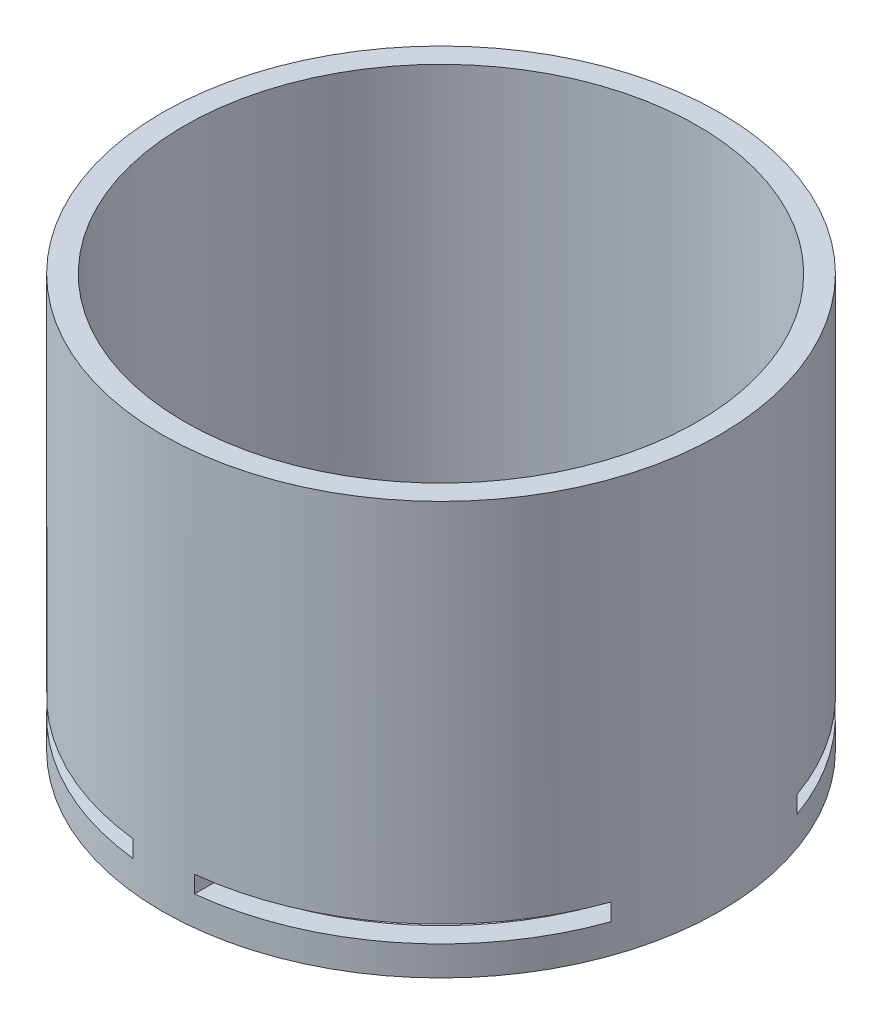
ISO-10303-21;
HEADER;
FILE_DESCRIPTION(('STEP AP214'),'2;1');
FILE_NAME('part.step','',(''),(''),'','','');
FILE_SCHEMA(('AUTOMOTIVE_DESIGN { 1 0 10303 214 1 1 1 1 }'));
ENDSEC;
DATA;
#1=APPLICATION_CONTEXT('core data for automotive mechanical design processes');
#2=APPLICATION_PROTOCOL_DEFINITION('international standard','automotive_design',2000,#1);
#3=PRODUCT_CONTEXT('',#1,'mechanical');
#4=PRODUCT('Part','Part','',(#3));
#5=PRODUCT_RELATED_PRODUCT_CATEGORY('part','',(#4));
#6=PRODUCT_DEFINITION_FORMATION('','',#4);
#7=PRODUCT_DEFINITION_CONTEXT('part definition',#1,'design');
#8=PRODUCT_DEFINITION('design','',#6,#7);
#9=PRODUCT_DEFINITION_SHAPE('','',#8);
#10=(LENGTH_UNIT() NAMED_UNIT(*) SI_UNIT(.MILLI.,.METRE.));
#11=(NAMED_UNIT(*) PLANE_ANGLE_UNIT() SI_UNIT($,.RADIAN.));
#12=(NAMED_UNIT(*) SI_UNIT($,.STERADIAN.) SOLID_ANGLE_UNIT());
#13=UNCERTAINTY_MEASURE_WITH_UNIT(LENGTH_MEASURE(1.E-05),#10,'distance_accuracy_value','');
#14=(GEOMETRIC_REPRESENTATION_CONTEXT(3) GLOBAL_UNCERTAINTY_ASSIGNED_CONTEXT((#13)) GLOBAL_UNIT_ASSIGNED_CONTEXT((#10,
#11,#12)) REPRESENTATION_CONTEXT('',''));
#15=CARTESIAN_POINT('',(0.,0.,0.));
#16=DIRECTION('',(0.,0.,1.));
#17=DIRECTION('',(1.,0.,0.));
#18=AXIS2_PLACEMENT_3D('',#15,#16,#17);
#19=CARTESIAN_POINT('',(0.,88.9,0.));
#20=DIRECTION('',(0.,-1.,0.));
#21=DIRECTION('',(0.,0.,-1.));
#22=AXIS2_PLACEMENT_3D('',#19,#20,#21);
#23=CYLINDRICAL_SURFACE('',#22,60.071);
#24=CARTESIAN_POINT('',(0.,6.34999999999999,0.));
#25=DIRECTION('',(0.,-1.,0.));
#26=DIRECTION('',(0.,0.,-1.));
#27=AXIS2_PLACEMENT_3D('',#24,#25,#26);
#28=CIRCLE('',#27,60.071);
#29=CARTESIAN_POINT('',(-6.604,6.34999999999999,59.7068859094159));
#30=VERTEX_POINT('',#29);
#31=CARTESIAN_POINT('',(-56.642,6.34999999999999,20.0052212434654));
#32=VERTEX_POINT('',#31);
#33=EDGE_CURVE('E229',#30,#32,#28,.T.);
#34=ORIENTED_EDGE('',*,*,#33,.T.);
#35=DIRECTION('',(0.,-1.,0.));
#36=VECTOR('',#35,1.);
#37=CARTESIAN_POINT('',(-56.642,88.9,20.0052212434654));
#38=LINE('',#37,#36);
#39=CARTESIAN_POINT('',(-56.642,10.033,20.0052212434654));
#40=VERTEX_POINT('',#39);
#41=EDGE_CURVE('E11',#32,#40,#38,.F.);
#42=ORIENTED_EDGE('',*,*,#41,.T.);
#43=CARTESIAN_POINT('',(0.,10.033,0.));
#44=DIRECTION('',(0.,1.,0.));
#45=DIRECTION('',(0.,0.,1.));
#46=AXIS2_PLACEMENT_3D('',#43,#44,#45);
#47=CIRCLE('',#46,60.071);
#48=CARTESIAN_POINT('',(-6.604,10.033,59.7068859094158));
#49=VERTEX_POINT('',#48);
#50=EDGE_CURVE('E199',#40,#49,#47,.T.);
#51=ORIENTED_EDGE('',*,*,#50,.T.);
#52=DIRECTION('',(0.,-1.,0.));
#53=VECTOR('',#52,1.);
#54=CARTESIAN_POINT('',(-6.604,88.9,59.7068859094159));
#55=LINE('',#54,#53);
#56=EDGE_CURVE('E232',#49,#30,#55,.T.);
#57=ORIENTED_EDGE('',*,*,#56,.T.);
#58=EDGE_LOOP('',(#34,#42,#51,#57));
#59=FACE_BOUND('',#58,.T.);
#60=CARTESIAN_POINT('',(-6.604,10.033,-59.7068859094159));
#61=VERTEX_POINT('',#60);
#62=CARTESIAN_POINT('',(-56.642,10.033,-20.0052212434654));
#63=VERTEX_POINT('',#62);
#64=EDGE_CURVE('E187',#61,#63,#47,.T.);
#65=ORIENTED_EDGE('',*,*,#64,.T.);
#66=DIRECTION('',(0.,-1.,0.));
#67=VECTOR('',#66,1.);
#68=CARTESIAN_POINT('',(-56.642,88.9,-20.0052212434654));
#69=LINE('',#68,#67);
#70=CARTESIAN_POINT('',(-56.642,6.34999999999999,-20.0052212434654));
#71=VERTEX_POINT('',#70);
#72=EDGE_CURVE('E49',#63,#71,#69,.T.);
#73=ORIENTED_EDGE('',*,*,#72,.T.);
#74=CARTESIAN_POINT('',(-6.604,6.34999999999999,-59.7068859094159));
#75=VERTEX_POINT('',#74);
#76=EDGE_CURVE('E186',#71,#75,#28,.T.);
#77=ORIENTED_EDGE('',*,*,#76,.T.);
#78=DIRECTION('',(0.,-1.,0.));
#79=VECTOR('',#78,1.);
#80=CARTESIAN_POINT('',(-6.604,88.9,-59.7068859094159));
#81=LINE('',#80,#79);
#82=EDGE_CURVE('E230',#75,#61,#81,.F.);
#83=ORIENTED_EDGE('',*,*,#82,.T.);
#84=EDGE_LOOP('',(#65,#73,#77,#83));
#85=FACE_BOUND('',#84,.T.);
#86=DIRECTION('',(0.,-1.,0.));
#87=VECTOR('',#86,1.);
#88=CARTESIAN_POINT('',(56.642,88.9,-20.0052212434654));
#89=LINE('',#88,#87);
#90=CARTESIAN_POINT('',(56.642,6.34999999999999,-20.0052212434654));
#91=VERTEX_POINT('',#90);
#92=CARTESIAN_POINT('',(56.642,10.033,-20.0052212434654));
#93=VERTEX_POINT('',#92);
#94=EDGE_CURVE('E178',#91,#93,#89,.F.);
#95=ORIENTED_EDGE('',*,*,#94,.T.);
#96=CARTESIAN_POINT('',(0.,10.033,0.));
#97=DIRECTION('',(0.,1.,0.));
#98=DIRECTION('',(0.,0.,1.));
#99=AXIS2_PLACEMENT_3D('',#96,#97,#98);
#100=CIRCLE('',#99,60.071);
#101=CARTESIAN_POINT('',(6.604,10.033,-59.7068859094159));
#102=VERTEX_POINT('',#101);
#103=EDGE_CURVE('E224',#93,#102,#100,.T.);
#104=ORIENTED_EDGE('',*,*,#103,.T.);
#105=DIRECTION('',(0.,-1.,0.));
#106=VECTOR('',#105,1.);
#107=CARTESIAN_POINT('',(6.604,88.9,-59.7068859094159));
#108=LINE('',#107,#106);
#109=CARTESIAN_POINT('',(6.604,6.35000000000001,-59.7068859094159));
#110=VERTEX_POINT('',#109);
#111=EDGE_CURVE('E204',#102,#110,#108,.T.);
#112=ORIENTED_EDGE('',*,*,#111,.T.);
#113=CARTESIAN_POINT('',(0.,6.34999999999999,0.));
#114=DIRECTION('',(0.,-1.,0.));
#115=DIRECTION('',(0.,0.,-1.));
#116=AXIS2_PLACEMENT_3D('',#113,#114,#115);
#117=CIRCLE('',#116,60.071);
#118=EDGE_CURVE('E148',#110,#91,#117,.T.);
#119=ORIENTED_EDGE('',*,*,#118,.T.);
#120=EDGE_LOOP('',(#95,#104,#112,#119));
#121=FACE_BOUND('',#120,.T.);
#122=DIRECTION('',(0.,-1.,0.));
#123=VECTOR('',#122,1.);
#124=CARTESIAN_POINT('',(6.604,88.9,59.7068859094159));
#125=LINE('',#124,#123);
#126=CARTESIAN_POINT('',(6.604,6.35,59.7068859094158));
#127=VERTEX_POINT('',#126);
#128=CARTESIAN_POINT('',(6.604,10.033,59.7068859094159));
#129=VERTEX_POINT('',#128);
#130=EDGE_CURVE('E200',#127,#129,#125,.F.);
#131=ORIENTED_EDGE('',*,*,#130,.T.);
#132=CARTESIAN_POINT('',(56.642,10.033,20.0052212434654));
#133=VERTEX_POINT('',#132);
#134=EDGE_CURVE('E227',#129,#133,#100,.T.);
#135=ORIENTED_EDGE('',*,*,#134,.T.);
#136=DIRECTION('',(0.,-1.,0.));
#137=VECTOR('',#136,1.);
#138=CARTESIAN_POINT('',(56.642,88.9,20.0052212434654));
#139=LINE('',#138,#137);
#140=CARTESIAN_POINT('',(56.642,6.34999999999999,20.0052212434654));
#141=VERTEX_POINT('',#140);
#142=EDGE_CURVE('E175',#133,#141,#139,.T.);
#143=ORIENTED_EDGE('',*,*,#142,.T.);
#144=EDGE_CURVE('E221',#141,#127,#117,.T.);
#145=ORIENTED_EDGE('',*,*,#144,.T.);
#146=EDGE_LOOP('',(#131,#135,#143,#145));
#147=FACE_BOUND('',#146,.T.);
#148=CARTESIAN_POINT('',(0.,88.9,0.));
#149=DIRECTION('',(0.,1.,0.));
#150=DIRECTION('',(0.,0.,1.));
#151=AXIS2_PLACEMENT_3D('',#148,#149,#150);
#152=CIRCLE('',#151,60.071);
#153=CARTESIAN_POINT('',(0.,88.9,60.071));
#154=VERTEX_POINT('',#153);
#155=EDGE_CURVE('E140',#154,#154,#152,.T.);
#156=ORIENTED_EDGE('',*,*,#155,.F.);
#157=EDGE_LOOP('',(#156));
#158=FACE_BOUND('',#157,.T.);
#159=CARTESIAN_POINT('',(0.,0.,0.));
#160=DIRECTION('',(0.,1.,0.));
#161=DIRECTION('',(0.,0.,1.));
#162=AXIS2_PLACEMENT_3D('',#159,#160,#161);
#163=CIRCLE('',#162,60.071);
#164=CARTESIAN_POINT('',(0.,0.,60.071));
#165=VERTEX_POINT('',#164);
#166=EDGE_CURVE('E239',#165,#165,#163,.T.);
#167=ORIENTED_EDGE('',*,*,#166,.T.);
#168=EDGE_LOOP('',(#167));
#169=FACE_BOUND('',#168,.T.);
#170=ADVANCED_FACE('F42',(#59,#85,#121,#147,#158,#169),#23,.T.);
#171=CARTESIAN_POINT('',(0.,88.9,0.));
#172=DIRECTION('',(0.,1.,0.));
#173=DIRECTION('',(0.,0.,1.));
#174=AXIS2_PLACEMENT_3D('',#171,#172,#173);
#175=PLANE('',#174);
#176=CARTESIAN_POINT('',(0.,88.9,0.));
#177=DIRECTION('',(0.,1.,0.));
#178=DIRECTION('',(0.,0.,1.));
#179=AXIS2_PLACEMENT_3D('',#176,#177,#178);
#180=CIRCLE('',#179,55.245);
#181=CARTESIAN_POINT('',(0.,88.9,55.245));
#182=VERTEX_POINT('',#181);
#183=EDGE_CURVE('E240',#182,#182,#180,.T.);
#184=ORIENTED_EDGE('',*,*,#183,.F.);
#185=EDGE_LOOP('',(#184));
#186=FACE_BOUND('',#185,.T.);
#187=ORIENTED_EDGE('',*,*,#155,.T.);
#188=EDGE_LOOP('',(#187));
#189=FACE_BOUND('',#188,.T.);
#190=ADVANCED_FACE('F250',(#186,#189),#175,.T.);
#191=CARTESIAN_POINT('',(0.,0.,0.));
#192=DIRECTION('',(0.,1.,0.));
#193=DIRECTION('',(0.,0.,1.));
#194=AXIS2_PLACEMENT_3D('',#191,#192,#193);
#195=PLANE('',#194);
#196=CARTESIAN_POINT('',(0.,0.,0.));
#197=DIRECTION('',(0.,1.,0.));
#198=DIRECTION('',(0.,0.,1.));
#199=AXIS2_PLACEMENT_3D('',#196,#197,#198);
#200=CIRCLE('',#199,55.245);
#201=CARTESIAN_POINT('',(0.,0.,55.245));
#202=VERTEX_POINT('',#201);
#203=EDGE_CURVE('E236',#202,#202,#200,.T.);
#204=ORIENTED_EDGE('',*,*,#203,.T.);
#205=EDGE_LOOP('',(#204));
#206=FACE_BOUND('',#205,.T.);
#207=ORIENTED_EDGE('',*,*,#166,.F.);
#208=EDGE_LOOP('',(#207));
#209=FACE_BOUND('',#208,.T.);
#210=ADVANCED_FACE('F248',(#206,#209),#195,.F.);
#211=CARTESIAN_POINT('',(0.,0.,0.));
#212=DIRECTION('',(0.,1.,0.));
#213=DIRECTION('',(0.,0.,1.));
#214=AXIS2_PLACEMENT_3D('',#211,#212,#213);
#215=CYLINDRICAL_SURFACE('',#214,55.245);
#216=DIRECTION('',(0.,1.,0.));
#217=VECTOR('',#216,1.);
#218=CARTESIAN_POINT('',(-6.604,0.,54.8488578641342));
#219=LINE('',#218,#217);
#220=CARTESIAN_POINT('',(-6.604,6.35,54.8488578641342));
#221=VERTEX_POINT('',#220);
#222=CARTESIAN_POINT('',(-6.604,10.033,54.8488578641342));
#223=VERTEX_POINT('',#222);
#224=EDGE_CURVE('E166',#221,#223,#219,.T.);
#225=ORIENTED_EDGE('',*,*,#224,.T.);
#226=CARTESIAN_POINT('',(0.,10.033,0.));
#227=DIRECTION('',(0.,1.,0.));
#228=DIRECTION('',(0.,0.,1.));
#229=AXIS2_PLACEMENT_3D('',#226,#227,#228);
#230=CIRCLE('',#229,55.245);
#231=CARTESIAN_POINT('',(-6.604,10.033,-54.8488578641342));
#232=VERTEX_POINT('',#231);
#233=EDGE_CURVE('E172',#223,#232,#230,.F.);
#234=ORIENTED_EDGE('',*,*,#233,.T.);
#235=DIRECTION('',(0.,1.,0.));
#236=VECTOR('',#235,1.);
#237=CARTESIAN_POINT('',(-6.604,0.,-54.8488578641342));
#238=LINE('',#237,#236);
#239=CARTESIAN_POINT('',(-6.604,6.35,-54.8488578641342));
#240=VERTEX_POINT('',#239);
#241=EDGE_CURVE('E169',#232,#240,#238,.F.);
#242=ORIENTED_EDGE('',*,*,#241,.T.);
#243=CARTESIAN_POINT('',(0.,6.35,0.));
#244=DIRECTION('',(0.,-1.,0.));
#245=DIRECTION('',(0.,0.,-1.));
#246=AXIS2_PLACEMENT_3D('',#243,#244,#245);
#247=CIRCLE('',#246,55.245);
#248=EDGE_CURVE('E163',#240,#221,#247,.F.);
#249=ORIENTED_EDGE('',*,*,#248,.T.);
#250=EDGE_LOOP('',(#225,#234,#242,#249));
#251=FACE_BOUND('',#250,.T.);
#252=CARTESIAN_POINT('',(0.,10.033,0.));
#253=DIRECTION('',(0.,1.,0.));
#254=DIRECTION('',(0.,0.,1.));
#255=AXIS2_PLACEMENT_3D('',#252,#253,#254);
#256=CIRCLE('',#255,55.245);
#257=CARTESIAN_POINT('',(6.604,10.033,-54.8488578641342));
#258=VERTEX_POINT('',#257);
#259=CARTESIAN_POINT('',(6.604,10.033,54.8488578641342));
#260=VERTEX_POINT('',#259);
#261=EDGE_CURVE('E157',#258,#260,#256,.F.);
#262=ORIENTED_EDGE('',*,*,#261,.T.);
#263=DIRECTION('',(0.,1.,0.));
#264=VECTOR('',#263,1.);
#265=CARTESIAN_POINT('',(6.604,0.,54.8488578641342));
#266=LINE('',#265,#264);
#267=CARTESIAN_POINT('',(6.604,6.35,54.8488578641342));
#268=VERTEX_POINT('',#267);
#269=EDGE_CURVE('E156',#260,#268,#266,.F.);
#270=ORIENTED_EDGE('',*,*,#269,.T.);
#271=CARTESIAN_POINT('',(0.,6.35,0.));
#272=DIRECTION('',(0.,-1.,0.));
#273=DIRECTION('',(0.,0.,-1.));
#274=AXIS2_PLACEMENT_3D('',#271,#272,#273);
#275=CIRCLE('',#274,55.245);
#276=CARTESIAN_POINT('',(6.604,6.35,-54.8488578641342));
#277=VERTEX_POINT('',#276);
#278=EDGE_CURVE('E139',#268,#277,#275,.F.);
#279=ORIENTED_EDGE('',*,*,#278,.T.);
#280=DIRECTION('',(0.,1.,0.));
#281=VECTOR('',#280,1.);
#282=CARTESIAN_POINT('',(6.604,0.,-54.8488578641342));
#283=LINE('',#282,#281);
#284=EDGE_CURVE('E128',#277,#258,#283,.T.);
#285=ORIENTED_EDGE('',*,*,#284,.T.);
#286=EDGE_LOOP('',(#262,#270,#279,#285));
#287=FACE_BOUND('',#286,.T.);
#288=ORIENTED_EDGE('',*,*,#203,.F.);
#289=EDGE_LOOP('',(#288));
#290=FACE_BOUND('',#289,.T.);
#291=ORIENTED_EDGE('',*,*,#183,.T.);
#292=EDGE_LOOP('',(#291));
#293=FACE_BOUND('',#292,.T.);
#294=ADVANCED_FACE('F154',(#251,#287,#290,#293),#215,.F.);
#295=CARTESIAN_POINT('',(56.642,10.033,-60.071));
#296=DIRECTION('',(1.,0.,0.));
#297=DIRECTION('',(0.,0.,-1.));
#298=AXIS2_PLACEMENT_3D('',#295,#296,#297);
#299=PLANE('',#298);
#300=DIRECTION('',(0.,0.,1.));
#301=VECTOR('',#300,1.);
#302=CARTESIAN_POINT('',(56.642,10.033,-60.071));
#303=LINE('',#302,#301);
#304=EDGE_CURVE('E217',#93,#133,#303,.T.);
#305=ORIENTED_EDGE('',*,*,#304,.F.);
#306=ORIENTED_EDGE('',*,*,#94,.F.);
#307=DIRECTION('',(0.,0.,1.));
#308=VECTOR('',#307,1.);
#309=CARTESIAN_POINT('',(56.642,6.35,-60.071));
#310=LINE('',#309,#308);
#311=EDGE_CURVE('E214',#91,#141,#310,.T.);
#312=ORIENTED_EDGE('',*,*,#311,.T.);
#313=ORIENTED_EDGE('',*,*,#142,.F.);
#314=EDGE_LOOP('',(#305,#306,#312,#313));
#315=FACE_BOUND('',#314,.T.);
#316=ADVANCED_FACE('F256',(#315),#299,.F.);
#317=CARTESIAN_POINT('',(56.642,10.033,-60.071));
#318=DIRECTION('',(0.,1.,0.));
#319=DIRECTION('',(0.,0.,1.));
#320=AXIS2_PLACEMENT_3D('',#317,#318,#319);
#321=PLANE('',#320);
#322=DIRECTION('',(0.,0.,1.));
#323=VECTOR('',#322,1.);
#324=CARTESIAN_POINT('',(6.604,10.033,-60.071));
#325=LINE('',#324,#323);
#326=EDGE_CURVE('E150',#260,#129,#325,.T.);
#327=ORIENTED_EDGE('',*,*,#326,.F.);
#328=ORIENTED_EDGE('',*,*,#261,.F.);
#329=EDGE_CURVE('E134',#102,#258,#325,.T.);
#330=ORIENTED_EDGE('',*,*,#329,.F.);
#331=ORIENTED_EDGE('',*,*,#103,.F.);
#332=ORIENTED_EDGE('',*,*,#304,.T.);
#333=ORIENTED_EDGE('',*,*,#134,.F.);
#334=EDGE_LOOP('',(#327,#328,#330,#331,#332,#333));
#335=FACE_BOUND('',#334,.T.);
#336=ADVANCED_FACE('F285',(#335),#321,.F.);
#337=CARTESIAN_POINT('',(56.642,6.35,-60.071));
#338=DIRECTION('',(0.,-1.,0.));
#339=DIRECTION('',(0.,0.,-1.));
#340=AXIS2_PLACEMENT_3D('',#337,#338,#339);
#341=PLANE('',#340);
#342=DIRECTION('',(0.,0.,1.));
#343=VECTOR('',#342,1.);
#344=CARTESIAN_POINT('',(6.604,6.35,-60.071));
#345=LINE('',#344,#343);
#346=EDGE_CURVE('E131',#110,#277,#345,.T.);
#347=ORIENTED_EDGE('',*,*,#346,.T.);
#348=ORIENTED_EDGE('',*,*,#278,.F.);
#349=EDGE_CURVE('E151',#268,#127,#345,.T.);
#350=ORIENTED_EDGE('',*,*,#349,.T.);
#351=ORIENTED_EDGE('',*,*,#144,.F.);
#352=ORIENTED_EDGE('',*,*,#311,.F.);
#353=ORIENTED_EDGE('',*,*,#118,.F.);
#354=EDGE_LOOP('',(#347,#348,#350,#351,#352,#353));
#355=FACE_BOUND('',#354,.T.);
#356=ADVANCED_FACE('F143',(#355),#341,.F.);
#357=CARTESIAN_POINT('',(6.604,10.033,-60.071));
#358=DIRECTION('',(-1.,0.,0.));
#359=DIRECTION('',(0.,0.,1.));
#360=AXIS2_PLACEMENT_3D('',#357,#358,#359);
#361=PLANE('',#360);
#362=ORIENTED_EDGE('',*,*,#329,.T.);
#363=ORIENTED_EDGE('',*,*,#284,.F.);
#364=ORIENTED_EDGE('',*,*,#346,.F.);
#365=ORIENTED_EDGE('',*,*,#111,.F.);
#366=EDGE_LOOP('',(#362,#363,#364,#365));
#367=FACE_BOUND('',#366,.T.);
#368=ADVANCED_FACE('F130',(#367),#361,.F.);
#369=ORIENTED_EDGE('',*,*,#349,.F.);
#370=ORIENTED_EDGE('',*,*,#269,.F.);
#371=ORIENTED_EDGE('',*,*,#326,.T.);
#372=ORIENTED_EDGE('',*,*,#130,.F.);
#373=EDGE_LOOP('',(#369,#370,#371,#372));
#374=FACE_BOUND('',#373,.T.);
#375=ADVANCED_FACE('F284',(#374),#361,.F.);
#376=CARTESIAN_POINT('',(-56.642,10.033,-60.071));
#377=DIRECTION('',(-1.,0.,0.));
#378=DIRECTION('',(0.,0.,1.));
#379=AXIS2_PLACEMENT_3D('',#376,#377,#378);
#380=PLANE('',#379);
#381=DIRECTION('',(0.,0.,1.));
#382=VECTOR('',#381,1.);
#383=CARTESIAN_POINT('',(-56.642,10.033,-60.071));
#384=LINE('',#383,#382);
#385=EDGE_CURVE('E192',#63,#40,#384,.T.);
#386=ORIENTED_EDGE('',*,*,#385,.T.);
#387=ORIENTED_EDGE('',*,*,#41,.F.);
#388=DIRECTION('',(0.,0.,1.));
#389=VECTOR('',#388,1.);
#390=CARTESIAN_POINT('',(-56.642,6.35,-60.071));
#391=LINE('',#390,#389);
#392=EDGE_CURVE('E56',#71,#32,#391,.T.);
#393=ORIENTED_EDGE('',*,*,#392,.F.);
#394=ORIENTED_EDGE('',*,*,#72,.F.);
#395=EDGE_LOOP('',(#386,#387,#393,#394));
#396=FACE_BOUND('',#395,.T.);
#397=ADVANCED_FACE('F191',(#396),#380,.F.);
#398=CARTESIAN_POINT('',(-56.642,10.033,-60.071));
#399=DIRECTION('',(0.,1.,0.));
#400=DIRECTION('',(0.,0.,1.));
#401=AXIS2_PLACEMENT_3D('',#398,#399,#400);
#402=PLANE('',#401);
#403=DIRECTION('',(0.,0.,1.));
#404=VECTOR('',#403,1.);
#405=CARTESIAN_POINT('',(-6.604,10.033,-60.071));
#406=LINE('',#405,#404);
#407=EDGE_CURVE('E201',#61,#232,#406,.T.);
#408=ORIENTED_EDGE('',*,*,#407,.T.);
#409=ORIENTED_EDGE('',*,*,#233,.F.);
#410=EDGE_CURVE('E206',#223,#49,#406,.T.);
#411=ORIENTED_EDGE('',*,*,#410,.T.);
#412=ORIENTED_EDGE('',*,*,#50,.F.);
#413=ORIENTED_EDGE('',*,*,#385,.F.);
#414=ORIENTED_EDGE('',*,*,#64,.F.);
#415=EDGE_LOOP('',(#408,#409,#411,#412,#413,#414));
#416=FACE_BOUND('',#415,.T.);
#417=ADVANCED_FACE('F195',(#416),#402,.F.);
#418=CARTESIAN_POINT('',(-6.604,10.033,-60.071));
#419=DIRECTION('',(1.,0.,0.));
#420=DIRECTION('',(0.,0.,-1.));
#421=AXIS2_PLACEMENT_3D('',#418,#419,#420);
#422=PLANE('',#421);
#423=ORIENTED_EDGE('',*,*,#410,.F.);
#424=ORIENTED_EDGE('',*,*,#224,.F.);
#425=DIRECTION('',(0.,0.,1.));
#426=VECTOR('',#425,1.);
#427=CARTESIAN_POINT('',(-6.604,6.35,-60.071));
#428=LINE('',#427,#426);
#429=EDGE_CURVE('E209',#221,#30,#428,.T.);
#430=ORIENTED_EDGE('',*,*,#429,.T.);
#431=ORIENTED_EDGE('',*,*,#56,.F.);
#432=EDGE_LOOP('',(#423,#424,#430,#431));
#433=FACE_BOUND('',#432,.T.);
#434=ADVANCED_FACE('F270',(#433),#422,.F.);
#435=EDGE_CURVE('E62',#75,#240,#428,.T.);
#436=ORIENTED_EDGE('',*,*,#435,.T.);
#437=ORIENTED_EDGE('',*,*,#241,.F.);
#438=ORIENTED_EDGE('',*,*,#407,.F.);
#439=ORIENTED_EDGE('',*,*,#82,.F.);
#440=EDGE_LOOP('',(#436,#437,#438,#439));
#441=FACE_BOUND('',#440,.T.);
#442=ADVANCED_FACE('F272',(#441),#422,.F.);
#443=CARTESIAN_POINT('',(-56.642,6.35,-60.071));
#444=DIRECTION('',(0.,-1.,0.));
#445=DIRECTION('',(0.,0.,-1.));
#446=AXIS2_PLACEMENT_3D('',#443,#444,#445);
#447=PLANE('',#446);
#448=ORIENTED_EDGE('',*,*,#429,.F.);
#449=ORIENTED_EDGE('',*,*,#248,.F.);
#450=ORIENTED_EDGE('',*,*,#435,.F.);
#451=ORIENTED_EDGE('',*,*,#76,.F.);
#452=ORIENTED_EDGE('',*,*,#392,.T.);
#453=ORIENTED_EDGE('',*,*,#33,.F.);
#454=EDGE_LOOP('',(#448,#449,#450,#451,#452,#453));
#455=FACE_BOUND('',#454,.T.);
#456=ADVANCED_FACE('F266',(#455),#447,.F.);
#457=CLOSED_SHELL('',(#170,#190,#210,#294,#316,#336,#356,#368,#375,#397,#417,#434,#442,#456));
#458=MANIFOLD_SOLID_BREP('B2',#457);
#459=ADVANCED_BREP_SHAPE_REPRESENTATION('',(#18,#458),#14);
#460=SHAPE_DEFINITION_REPRESENTATION(#9,#459);
ENDSEC;
END-ISO-10303-21;
